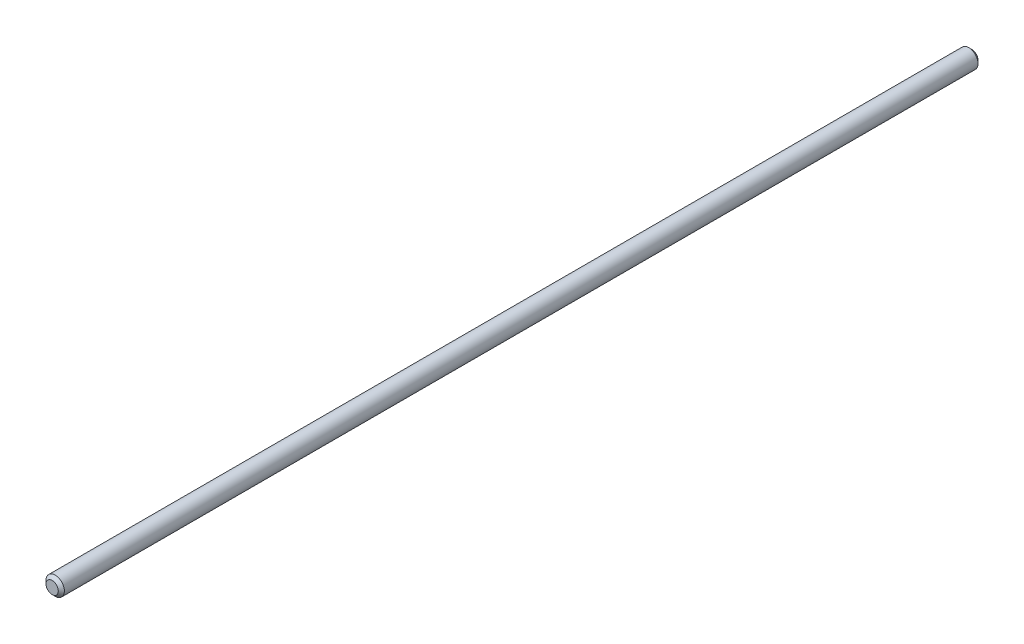
ISO-10303-21;
HEADER;
FILE_DESCRIPTION(('STEP AP214'),'2;1');
FILE_NAME('part.step','',(''),(''),'','','');
FILE_SCHEMA(('AUTOMOTIVE_DESIGN { 1 0 10303 214 1 1 1 1 }'));
ENDSEC;
DATA;
#1=APPLICATION_CONTEXT('core data for automotive mechanical design processes');
#2=APPLICATION_PROTOCOL_DEFINITION('international standard','automotive_design',2000,#1);
#3=PRODUCT_CONTEXT('',#1,'mechanical');
#4=PRODUCT('Part','Part','',(#3));
#5=PRODUCT_RELATED_PRODUCT_CATEGORY('part','',(#4));
#6=PRODUCT_DEFINITION_FORMATION('','',#4);
#7=PRODUCT_DEFINITION_CONTEXT('part definition',#1,'design');
#8=PRODUCT_DEFINITION('design','',#6,#7);
#9=PRODUCT_DEFINITION_SHAPE('','',#8);
#10=(LENGTH_UNIT() NAMED_UNIT(*) SI_UNIT(.MILLI.,.METRE.));
#11=(NAMED_UNIT(*) PLANE_ANGLE_UNIT() SI_UNIT($,.RADIAN.));
#12=(NAMED_UNIT(*) SI_UNIT($,.STERADIAN.) SOLID_ANGLE_UNIT());
#13=UNCERTAINTY_MEASURE_WITH_UNIT(LENGTH_MEASURE(1.E-05),#10,'distance_accuracy_value','');
#14=(GEOMETRIC_REPRESENTATION_CONTEXT(3) GLOBAL_UNCERTAINTY_ASSIGNED_CONTEXT((#13)) GLOBAL_UNIT_ASSIGNED_CONTEXT((#10,
#11,#12)) REPRESENTATION_CONTEXT('',''));
#15=CARTESIAN_POINT('',(0.,0.,0.));
#16=DIRECTION('',(0.,0.,1.));
#17=DIRECTION('',(1.,0.,0.));
#18=AXIS2_PLACEMENT_3D('',#15,#16,#17);
#19=CARTESIAN_POINT('',(0.,0.,150.));
#20=DIRECTION('',(0.,0.,-1.));
#21=DIRECTION('',(-1.,0.,0.));
#22=AXIS2_PLACEMENT_3D('',#19,#20,#21);
#23=PLANE('',#22);
#24=CARTESIAN_POINT('',(0.,0.,150.000000000205));
#25=DIRECTION('',(0.,0.,-1.));
#26=DIRECTION('',(-1.,0.,0.));
#27=AXIS2_PLACEMENT_3D('',#24,#25,#26);
#28=CIRCLE('',#27,1.00000000020373);
#29=CARTESIAN_POINT('',(-1.00000000020373,0.,150.000000000205));
#30=VERTEX_POINT('',#29);
#31=EDGE_CURVE('E18',#30,#30,#28,.T.);
#32=ORIENTED_EDGE('',*,*,#31,.F.);
#33=EDGE_LOOP('',(#32));
#34=FACE_BOUND('',#33,.T.);
#35=ADVANCED_FACE('F15',(#34),#23,.F.);
#36=CARTESIAN_POINT('',(0.,0.,0.));
#37=DIRECTION('',(0.,0.,-1.));
#38=DIRECTION('',(-1.,0.,0.));
#39=AXIS2_PLACEMENT_3D('',#36,#37,#38);
#40=PLANE('',#39);
#41=CARTESIAN_POINT('',(0.,0.,-2.27373675443232E-10));
#42=DIRECTION('',(0.,0.,1.));
#43=DIRECTION('',(1.,0.,0.));
#44=AXIS2_PLACEMENT_3D('',#41,#42,#43);
#45=CIRCLE('',#44,1.00000000020373);
#46=CARTESIAN_POINT('',(1.00000000020373,0.,-2.27373675443232E-10));
#47=VERTEX_POINT('',#46);
#48=EDGE_CURVE('E27',#47,#47,#45,.T.);
#49=ORIENTED_EDGE('',*,*,#48,.F.);
#50=EDGE_LOOP('',(#49));
#51=FACE_BOUND('',#50,.T.);
#52=ADVANCED_FACE('F42',(#51),#40,.T.);
#53=CARTESIAN_POINT('',(0.,0.,149.499999999875));
#54=DIRECTION('',(0.,0.,-1.));
#55=DIRECTION('',(-1.,0.,0.));
#56=AXIS2_PLACEMENT_3D('',#53,#54,#55);
#57=CONICAL_SURFACE('',#56,1.49999999968031,0.785398162544797);
#58=CARTESIAN_POINT('',(0.,0.,149.5));
#59=DIRECTION('',(0.,0.,1.));
#60=DIRECTION('',(1.,0.,0.));
#61=AXIS2_PLACEMENT_3D('',#58,#59,#60);
#62=CIRCLE('',#61,1.5);
#63=CARTESIAN_POINT('',(1.5,0.,149.5));
#64=VERTEX_POINT('',#63);
#65=EDGE_CURVE('E22',#64,#64,#62,.F.);
#66=ORIENTED_EDGE('',*,*,#65,.F.);
#67=EDGE_LOOP('',(#66));
#68=FACE_BOUND('',#67,.T.);
#69=ORIENTED_EDGE('',*,*,#31,.T.);
#70=EDGE_LOOP('',(#69));
#71=FACE_BOUND('',#70,.T.);
#72=ADVANCED_FACE('F39',(#68,#71),#57,.T.);
#73=CARTESIAN_POINT('',(0.,0.,0.50000000021555));
#74=DIRECTION('',(0.,0.,1.));
#75=DIRECTION('',(1.,0.,0.));
#76=AXIS2_PLACEMENT_3D('',#73,#74,#75);
#77=CONICAL_SURFACE('',#76,1.49999999973716,0.785398162487954);
#78=ORIENTED_EDGE('',*,*,#48,.T.);
#79=EDGE_LOOP('',(#78));
#80=FACE_BOUND('',#79,.T.);
#81=CARTESIAN_POINT('',(0.,0.,0.5));
#82=DIRECTION('',(0.,0.,1.));
#83=DIRECTION('',(1.,0.,0.));
#84=AXIS2_PLACEMENT_3D('',#81,#82,#83);
#85=CIRCLE('',#84,1.5);
#86=CARTESIAN_POINT('',(1.5,0.,0.5));
#87=VERTEX_POINT('',#86);
#88=EDGE_CURVE('E10',#87,#87,#85,.T.);
#89=ORIENTED_EDGE('',*,*,#88,.F.);
#90=EDGE_LOOP('',(#89));
#91=FACE_BOUND('',#90,.T.);
#92=ADVANCED_FACE('F50',(#80,#91),#77,.T.);
#93=CARTESIAN_POINT('',(0.,0.,0.));
#94=DIRECTION('',(0.,0.,1.));
#95=DIRECTION('',(1.,0.,0.));
#96=AXIS2_PLACEMENT_3D('',#93,#94,#95);
#97=CYLINDRICAL_SURFACE('',#96,1.5);
#98=ORIENTED_EDGE('',*,*,#88,.T.);
#99=EDGE_LOOP('',(#98));
#100=FACE_BOUND('',#99,.T.);
#101=ORIENTED_EDGE('',*,*,#65,.T.);
#102=EDGE_LOOP('',(#101));
#103=FACE_BOUND('',#102,.T.);
#104=ADVANCED_FACE('F48',(#100,#103),#97,.T.);
#105=CLOSED_SHELL('',(#35,#52,#72,#92,#104));
#106=MANIFOLD_SOLID_BREP('B1',#105);
#107=ADVANCED_BREP_SHAPE_REPRESENTATION('',(#18,#106),#14);
#108=SHAPE_DEFINITION_REPRESENTATION(#9,#107);
ENDSEC;
END-ISO-10303-21;
